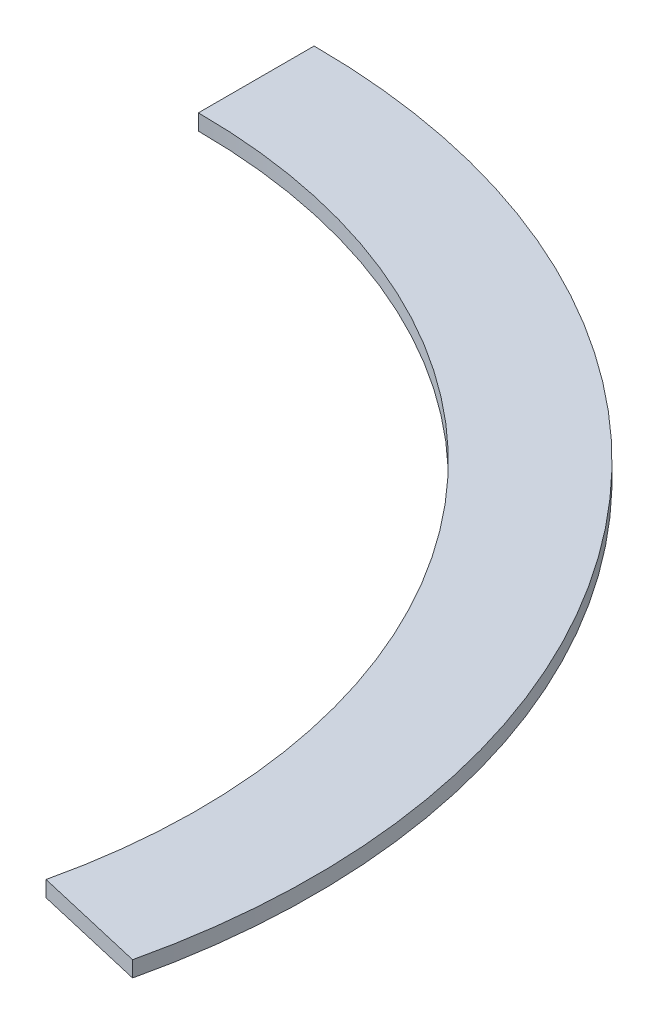
ISO-10303-21;
HEADER;
FILE_DESCRIPTION(('STEP AP214'),'2;1');
FILE_NAME('part.step','',(''),(''),'','','');
FILE_SCHEMA(('AUTOMOTIVE_DESIGN { 1 0 10303 214 1 1 1 1 }'));
ENDSEC;
DATA;
#1=APPLICATION_CONTEXT('core data for automotive mechanical design processes');
#2=APPLICATION_PROTOCOL_DEFINITION('international standard','automotive_design',2000,#1);
#3=PRODUCT_CONTEXT('',#1,'mechanical');
#4=PRODUCT('Part','Part','',(#3));
#5=PRODUCT_RELATED_PRODUCT_CATEGORY('part','',(#4));
#6=PRODUCT_DEFINITION_FORMATION('','',#4);
#7=PRODUCT_DEFINITION_CONTEXT('part definition',#1,'design');
#8=PRODUCT_DEFINITION('design','',#6,#7);
#9=PRODUCT_DEFINITION_SHAPE('','',#8);
#10=(LENGTH_UNIT() NAMED_UNIT(*) SI_UNIT(.MILLI.,.METRE.));
#11=(NAMED_UNIT(*) PLANE_ANGLE_UNIT() SI_UNIT($,.RADIAN.));
#12=(NAMED_UNIT(*) SI_UNIT($,.STERADIAN.) SOLID_ANGLE_UNIT());
#13=UNCERTAINTY_MEASURE_WITH_UNIT(LENGTH_MEASURE(1.E-05),#10,'distance_accuracy_value','');
#14=(GEOMETRIC_REPRESENTATION_CONTEXT(3) GLOBAL_UNCERTAINTY_ASSIGNED_CONTEXT((#13)) GLOBAL_UNIT_ASSIGNED_CONTEXT((#10,
#11,#12)) REPRESENTATION_CONTEXT('',''));
#15=CARTESIAN_POINT('',(0.,0.,0.));
#16=DIRECTION('',(0.,0.,1.));
#17=DIRECTION('',(1.,0.,0.));
#18=AXIS2_PLACEMENT_3D('',#15,#16,#17);
#19=CARTESIAN_POINT('',(0.,1.,0.));
#20=DIRECTION('',(0.,-1.,0.));
#21=DIRECTION('',(0.,0.,-1.));
#22=AXIS2_PLACEMENT_3D('',#19,#20,#21);
#23=CYLINDRICAL_SURFACE('',#22,38.0918725258121);
#24=CARTESIAN_POINT('',(0.,0.,0.));
#25=DIRECTION('',(0.,-1.,0.));
#26=DIRECTION('',(0.,0.,-1.));
#27=AXIS2_PLACEMENT_3D('',#24,#25,#26);
#28=CIRCLE('',#27,38.0918725258121);
#29=CARTESIAN_POINT('',(0.,0.,-38.0918725258121));
#30=VERTEX_POINT('',#29);
#31=CARTESIAN_POINT('',(37.1022794871726,0.,8.62621639993202));
#32=VERTEX_POINT('',#31);
#33=EDGE_CURVE('E100',#30,#32,#28,.T.);
#34=ORIENTED_EDGE('',*,*,#33,.T.);
#35=DIRECTION('',(0.,-1.,0.));
#36=VECTOR('',#35,1.);
#37=CARTESIAN_POINT('',(37.1022794871726,1.,8.62621639993202));
#38=LINE('',#37,#36);
#39=CARTESIAN_POINT('',(37.1022794871726,1.,8.62621639993202));
#40=VERTEX_POINT('',#39);
#41=EDGE_CURVE('E11',#40,#32,#38,.T.);
#42=ORIENTED_EDGE('',*,*,#41,.F.);
#43=CARTESIAN_POINT('',(0.,1.,0.));
#44=DIRECTION('',(0.,-1.,0.));
#45=DIRECTION('',(0.,0.,-1.));
#46=AXIS2_PLACEMENT_3D('',#43,#44,#45);
#47=CIRCLE('',#46,38.0918725258121);
#48=CARTESIAN_POINT('',(0.,1.,-38.0918725258121));
#49=VERTEX_POINT('',#48);
#50=EDGE_CURVE('E88',#49,#40,#47,.T.);
#51=ORIENTED_EDGE('',*,*,#50,.F.);
#52=DIRECTION('',(0.,-1.,0.));
#53=VECTOR('',#52,1.);
#54=CARTESIAN_POINT('',(0.,1.,-38.0918725258121));
#55=LINE('',#54,#53);
#56=EDGE_CURVE('E96',#49,#30,#55,.T.);
#57=ORIENTED_EDGE('',*,*,#56,.T.);
#58=EDGE_LOOP('',(#34,#42,#51,#57));
#59=FACE_BOUND('',#58,.T.);
#60=ADVANCED_FACE('F37',(#59),#23,.F.);
#61=CARTESIAN_POINT('',(37.1022794871726,1.,8.62621639993202));
#62=DIRECTION('',(0.226458216405121,0.,-0.974020880793945));
#63=DIRECTION('',(-0.974020880793945,0.,-0.226458216405121));
#64=AXIS2_PLACEMENT_3D('',#61,#62,#63);
#65=PLANE('',#64);
#66=DIRECTION('',(0.974020880793944,0.,0.226458216405121));
#67=VECTOR('',#66,1.);
#68=CARTESIAN_POINT('',(37.1022794871726,0.,8.62621639993202));
#69=LINE('',#68,#67);
#70=CARTESIAN_POINT('',(44.2184294263116,0.,10.2807092908598));
#71=VERTEX_POINT('',#70);
#72=EDGE_CURVE('E92',#32,#71,#69,.T.);
#73=ORIENTED_EDGE('',*,*,#72,.T.);
#74=DIRECTION('',(0.,-1.,0.));
#75=VECTOR('',#74,1.);
#76=CARTESIAN_POINT('',(44.2184294263116,1.,10.2807092908598));
#77=LINE('',#76,#75);
#78=CARTESIAN_POINT('',(44.2184294263116,1.,10.2807092908598));
#79=VERTEX_POINT('',#78);
#80=EDGE_CURVE('E45',#79,#71,#77,.T.);
#81=ORIENTED_EDGE('',*,*,#80,.F.);
#82=DIRECTION('',(0.974020880793944,0.,0.226458216405121));
#83=VECTOR('',#82,1.);
#84=CARTESIAN_POINT('',(37.1022794871726,1.,8.62621639993202));
#85=LINE('',#84,#83);
#86=EDGE_CURVE('E83',#40,#79,#85,.T.);
#87=ORIENTED_EDGE('',*,*,#86,.F.);
#88=ORIENTED_EDGE('',*,*,#41,.T.);
#89=EDGE_LOOP('',(#73,#81,#87,#88));
#90=FACE_BOUND('',#89,.T.);
#91=ADVANCED_FACE('F91',(#90),#65,.F.);
#92=CARTESIAN_POINT('',(0.,1.,0.));
#93=DIRECTION('',(0.,-1.,0.));
#94=DIRECTION('',(0.,0.,-1.));
#95=AXIS2_PLACEMENT_3D('',#92,#93,#94);
#96=CYLINDRICAL_SURFACE('',#95,45.3978246665286);
#97=CARTESIAN_POINT('',(0.,0.,0.));
#98=DIRECTION('',(0.,1.,0.));
#99=DIRECTION('',(0.,0.,-1.));
#100=AXIS2_PLACEMENT_3D('',#97,#98,#99);
#101=CIRCLE('',#100,45.3978246665286);
#102=CARTESIAN_POINT('',(0.,0.,-45.3978246665286));
#103=VERTEX_POINT('',#102);
#104=EDGE_CURVE('E70',#71,#103,#101,.T.);
#105=ORIENTED_EDGE('',*,*,#104,.T.);
#106=DIRECTION('',(0.,-1.,0.));
#107=VECTOR('',#106,1.);
#108=CARTESIAN_POINT('',(0.,1.,-45.3978246665286));
#109=LINE('',#108,#107);
#110=CARTESIAN_POINT('',(0.,1.,-45.3978246665286));
#111=VERTEX_POINT('',#110);
#112=EDGE_CURVE('E93',#111,#103,#109,.T.);
#113=ORIENTED_EDGE('',*,*,#112,.F.);
#114=CARTESIAN_POINT('',(0.,1.,0.));
#115=DIRECTION('',(0.,1.,0.));
#116=DIRECTION('',(0.,0.,-1.));
#117=AXIS2_PLACEMENT_3D('',#114,#115,#116);
#118=CIRCLE('',#117,45.3978246665286);
#119=EDGE_CURVE('E86',#79,#111,#118,.T.);
#120=ORIENTED_EDGE('',*,*,#119,.F.);
#121=ORIENTED_EDGE('',*,*,#80,.T.);
#122=EDGE_LOOP('',(#105,#113,#120,#121));
#123=FACE_BOUND('',#122,.T.);
#124=ADVANCED_FACE('F94',(#123),#96,.T.);
#125=CARTESIAN_POINT('',(0.,1.,-38.0918725258121));
#126=DIRECTION('',(1.,0.,0.));
#127=DIRECTION('',(0.,0.,-1.));
#128=AXIS2_PLACEMENT_3D('',#125,#126,#127);
#129=PLANE('',#128);
#130=DIRECTION('',(0.,0.,1.));
#131=VECTOR('',#130,1.);
#132=CARTESIAN_POINT('',(0.,0.,-38.0918725258121));
#133=LINE('',#132,#131);
#134=EDGE_CURVE('E76',#103,#30,#133,.T.);
#135=ORIENTED_EDGE('',*,*,#134,.T.);
#136=ORIENTED_EDGE('',*,*,#56,.F.);
#137=DIRECTION('',(0.,0.,1.));
#138=VECTOR('',#137,1.);
#139=CARTESIAN_POINT('',(0.,1.,-38.0918725258121));
#140=LINE('',#139,#138);
#141=EDGE_CURVE('E53',#111,#49,#140,.T.);
#142=ORIENTED_EDGE('',*,*,#141,.F.);
#143=ORIENTED_EDGE('',*,*,#112,.T.);
#144=EDGE_LOOP('',(#135,#136,#142,#143));
#145=FACE_BOUND('',#144,.T.);
#146=ADVANCED_FACE('F107',(#145),#129,.F.);
#147=CARTESIAN_POINT('',(0.,1.,0.));
#148=DIRECTION('',(0.,-1.,0.));
#149=DIRECTION('',(0.,0.,-1.));
#150=AXIS2_PLACEMENT_3D('',#147,#148,#149);
#151=PLANE('',#150);
#152=ORIENTED_EDGE('',*,*,#50,.T.);
#153=ORIENTED_EDGE('',*,*,#86,.T.);
#154=ORIENTED_EDGE('',*,*,#119,.T.);
#155=ORIENTED_EDGE('',*,*,#141,.T.);
#156=EDGE_LOOP('',(#152,#153,#154,#155));
#157=FACE_BOUND('',#156,.T.);
#158=ADVANCED_FACE('F84',(#157),#151,.F.);
#159=CARTESIAN_POINT('',(0.,0.,0.));
#160=DIRECTION('',(0.,-1.,0.));
#161=DIRECTION('',(0.,0.,-1.));
#162=AXIS2_PLACEMENT_3D('',#159,#160,#161);
#163=PLANE('',#162);
#164=ORIENTED_EDGE('',*,*,#33,.F.);
#165=ORIENTED_EDGE('',*,*,#134,.F.);
#166=ORIENTED_EDGE('',*,*,#104,.F.);
#167=ORIENTED_EDGE('',*,*,#72,.F.);
#168=EDGE_LOOP('',(#164,#165,#166,#167));
#169=FACE_BOUND('',#168,.T.);
#170=ADVANCED_FACE('F110',(#169),#163,.T.);
#171=CLOSED_SHELL('',(#60,#91,#124,#146,#158,#170));
#172=MANIFOLD_SOLID_BREP('B2',#171);
#173=ADVANCED_BREP_SHAPE_REPRESENTATION('',(#18,#172),#14);
#174=SHAPE_DEFINITION_REPRESENTATION(#9,#173);
ENDSEC;
END-ISO-10303-21;
